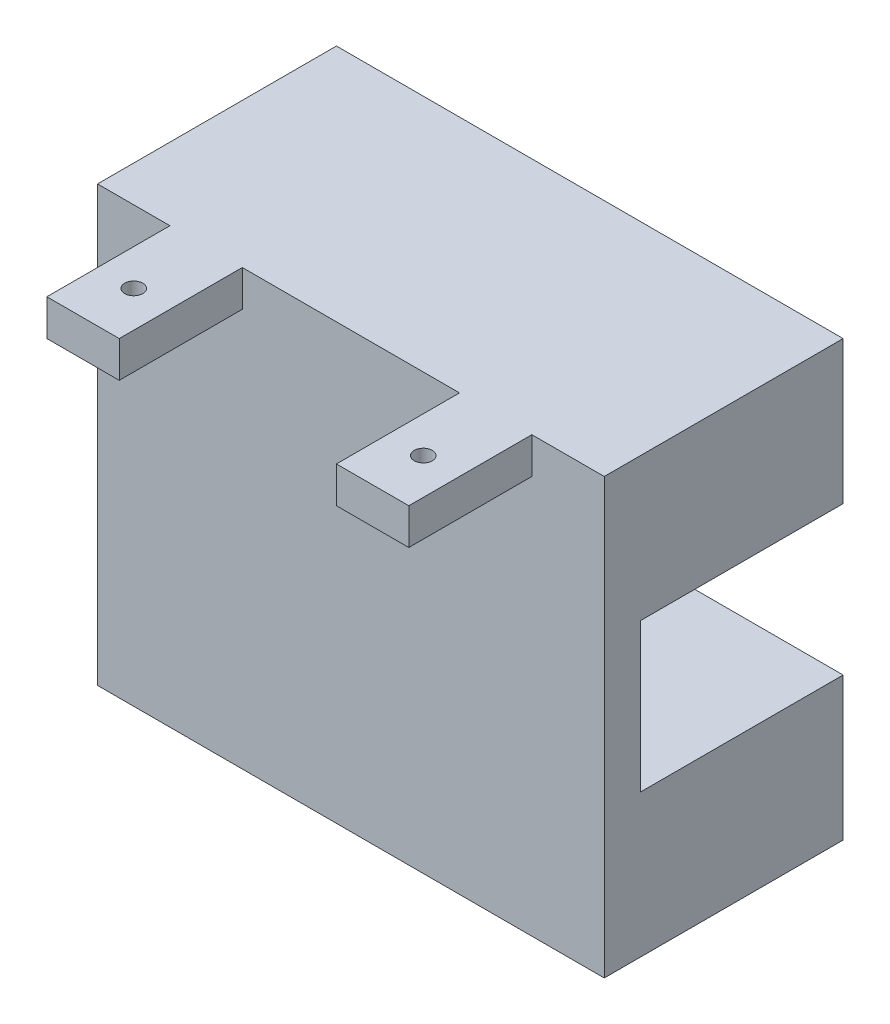
ISO-10303-21;
HEADER;
FILE_DESCRIPTION(('STEP AP214'),'2;1');
FILE_NAME('part.step','',(''),(''),'','','');
FILE_SCHEMA(('AUTOMOTIVE_DESIGN { 1 0 10303 214 1 1 1 1 }'));
ENDSEC;
DATA;
#1=APPLICATION_CONTEXT('core data for automotive mechanical design processes');
#2=APPLICATION_PROTOCOL_DEFINITION('international standard','automotive_design',2000,#1);
#3=PRODUCT_CONTEXT('',#1,'mechanical');
#4=PRODUCT('Part','Part','',(#3));
#5=PRODUCT_RELATED_PRODUCT_CATEGORY('part','',(#4));
#6=PRODUCT_DEFINITION_FORMATION('','',#4);
#7=PRODUCT_DEFINITION_CONTEXT('part definition',#1,'design');
#8=PRODUCT_DEFINITION('design','',#6,#7);
#9=PRODUCT_DEFINITION_SHAPE('','',#8);
#10=(LENGTH_UNIT() NAMED_UNIT(*) SI_UNIT(.MILLI.,.METRE.));
#11=(NAMED_UNIT(*) PLANE_ANGLE_UNIT() SI_UNIT($,.RADIAN.));
#12=(NAMED_UNIT(*) SI_UNIT($,.STERADIAN.) SOLID_ANGLE_UNIT());
#13=UNCERTAINTY_MEASURE_WITH_UNIT(LENGTH_MEASURE(1.E-05),#10,'distance_accuracy_value','');
#14=(GEOMETRIC_REPRESENTATION_CONTEXT(3) GLOBAL_UNCERTAINTY_ASSIGNED_CONTEXT((#13)) GLOBAL_UNIT_ASSIGNED_CONTEXT((#10,
#11,#12)) REPRESENTATION_CONTEXT('',''));
#15=CARTESIAN_POINT('',(0.,0.,0.));
#16=DIRECTION('',(0.,0.,1.));
#17=DIRECTION('',(1.,0.,0.));
#18=AXIS2_PLACEMENT_3D('',#15,#16,#17);
#19=CARTESIAN_POINT('',(0.,0.,33.));
#20=DIRECTION('',(0.,0.,1.));
#21=DIRECTION('',(1.,0.,0.));
#22=AXIS2_PLACEMENT_3D('',#19,#20,#21);
#23=PLANE('',#22);
#24=DIRECTION('',(-1.,0.,0.));
#25=VECTOR('',#24,1.);
#26=CARTESIAN_POINT('',(0.,25.,33.));
#27=LINE('',#26,#25);
#28=CARTESIAN_POINT('',(25.,25.,33.));
#29=VERTEX_POINT('',#28);
#30=CARTESIAN_POINT('',(15.,25.,33.));
#31=VERTEX_POINT('',#30);
#32=EDGE_CURVE('E186',#29,#31,#27,.T.);
#33=ORIENTED_EDGE('',*,*,#32,.T.);
#34=DIRECTION('',(0.,1.,0.));
#35=VECTOR('',#34,1.);
#36=CARTESIAN_POINT('',(15.,0.,33.));
#37=LINE('',#36,#35);
#38=CARTESIAN_POINT('',(15.,30.,33.));
#39=VERTEX_POINT('',#38);
#40=EDGE_CURVE('E179',#31,#39,#37,.T.);
#41=ORIENTED_EDGE('',*,*,#40,.T.);
#42=DIRECTION('',(-1.,0.,0.));
#43=VECTOR('',#42,1.);
#44=CARTESIAN_POINT('',(-35.,30.,33.));
#45=LINE('',#44,#43);
#46=CARTESIAN_POINT('',(-15.,30.,33.));
#47=VERTEX_POINT('',#46);
#48=EDGE_CURVE('E243',#39,#47,#45,.T.);
#49=ORIENTED_EDGE('',*,*,#48,.T.);
#50=DIRECTION('',(0.,-1.,0.));
#51=VECTOR('',#50,1.);
#52=CARTESIAN_POINT('',(-15.,0.,33.));
#53=LINE('',#52,#51);
#54=CARTESIAN_POINT('',(-15.,25.,33.));
#55=VERTEX_POINT('',#54);
#56=EDGE_CURVE('E267',#47,#55,#53,.T.);
#57=ORIENTED_EDGE('',*,*,#56,.T.);
#58=DIRECTION('',(-1.,0.,0.));
#59=VECTOR('',#58,1.);
#60=CARTESIAN_POINT('',(0.,25.,33.));
#61=LINE('',#60,#59);
#62=CARTESIAN_POINT('',(-25.,25.,33.));
#63=VERTEX_POINT('',#62);
#64=EDGE_CURVE('E49',#55,#63,#61,.T.);
#65=ORIENTED_EDGE('',*,*,#64,.T.);
#66=DIRECTION('',(0.,1.,0.));
#67=VECTOR('',#66,1.);
#68=CARTESIAN_POINT('',(-25.,0.,33.));
#69=LINE('',#68,#67);
#70=CARTESIAN_POINT('',(-25.,30.,33.));
#71=VERTEX_POINT('',#70);
#72=EDGE_CURVE('E11',#63,#71,#69,.T.);
#73=ORIENTED_EDGE('',*,*,#72,.T.);
#74=CARTESIAN_POINT('',(-35.,30.,33.));
#75=VERTEX_POINT('',#74);
#76=EDGE_CURVE('E238',#71,#75,#45,.T.);
#77=ORIENTED_EDGE('',*,*,#76,.T.);
#78=DIRECTION('',(0.,-1.,0.));
#79=VECTOR('',#78,1.);
#80=CARTESIAN_POINT('',(-35.,30.,33.));
#81=LINE('',#80,#79);
#82=CARTESIAN_POINT('',(-35.,-30.,33.));
#83=VERTEX_POINT('',#82);
#84=EDGE_CURVE('E242',#75,#83,#81,.T.);
#85=ORIENTED_EDGE('',*,*,#84,.T.);
#86=DIRECTION('',(1.,0.,0.));
#87=VECTOR('',#86,1.);
#88=CARTESIAN_POINT('',(-35.,-30.,33.));
#89=LINE('',#88,#87);
#90=CARTESIAN_POINT('',(35.,-30.,33.));
#91=VERTEX_POINT('',#90);
#92=EDGE_CURVE('E245',#83,#91,#89,.T.);
#93=ORIENTED_EDGE('',*,*,#92,.T.);
#94=DIRECTION('',(0.,1.,0.));
#95=VECTOR('',#94,1.);
#96=CARTESIAN_POINT('',(35.,30.,33.));
#97=LINE('',#96,#95);
#98=CARTESIAN_POINT('',(35.,30.,33.));
#99=VERTEX_POINT('',#98);
#100=EDGE_CURVE('E235',#91,#99,#97,.T.);
#101=ORIENTED_EDGE('',*,*,#100,.T.);
#102=CARTESIAN_POINT('',(25.,30.,33.));
#103=VERTEX_POINT('',#102);
#104=EDGE_CURVE('E240',#99,#103,#45,.T.);
#105=ORIENTED_EDGE('',*,*,#104,.T.);
#106=DIRECTION('',(0.,-1.,0.));
#107=VECTOR('',#106,1.);
#108=CARTESIAN_POINT('',(25.,0.,33.));
#109=LINE('',#108,#107);
#110=EDGE_CURVE('E170',#103,#29,#109,.T.);
#111=ORIENTED_EDGE('',*,*,#110,.T.);
#112=EDGE_LOOP('',(#33,#41,#49,#57,#65,#73,#77,#85,#93,#101,#105,#111));
#113=FACE_BOUND('',#112,.T.);
#114=ADVANCED_FACE('F40',(#113),#23,.T.);
#115=CARTESIAN_POINT('',(0.,0.,0.));
#116=DIRECTION('',(0.,0.,1.));
#117=DIRECTION('',(1.,0.,0.));
#118=AXIS2_PLACEMENT_3D('',#115,#116,#117);
#119=PLANE('',#118);
#120=DIRECTION('',(0.,-1.,0.));
#121=VECTOR('',#120,1.);
#122=CARTESIAN_POINT('',(-35.,30.,0.));
#123=LINE('',#122,#121);
#124=CARTESIAN_POINT('',(-35.,30.,0.));
#125=VERTEX_POINT('',#124);
#126=CARTESIAN_POINT('',(-35.,-30.,0.));
#127=VERTEX_POINT('',#126);
#128=EDGE_CURVE('E253',#125,#127,#123,.T.);
#129=ORIENTED_EDGE('',*,*,#128,.F.);
#130=DIRECTION('',(-1.,0.,0.));
#131=VECTOR('',#130,1.);
#132=CARTESIAN_POINT('',(-35.,30.,0.));
#133=LINE('',#132,#131);
#134=CARTESIAN_POINT('',(35.,30.,0.));
#135=VERTEX_POINT('',#134);
#136=EDGE_CURVE('E251',#135,#125,#133,.T.);
#137=ORIENTED_EDGE('',*,*,#136,.F.);
#138=DIRECTION('',(0.,1.,0.));
#139=VECTOR('',#138,1.);
#140=CARTESIAN_POINT('',(35.,30.,0.));
#141=LINE('',#140,#139);
#142=CARTESIAN_POINT('',(35.,10.25,0.));
#143=VERTEX_POINT('',#142);
#144=EDGE_CURVE('E234',#143,#135,#141,.T.);
#145=ORIENTED_EDGE('',*,*,#144,.F.);
#146=DIRECTION('',(1.,0.,0.));
#147=VECTOR('',#146,1.);
#148=CARTESIAN_POINT('',(-20.35,10.25,0.));
#149=LINE('',#148,#147);
#150=CARTESIAN_POINT('',(-20.35,10.25,0.));
#151=VERTEX_POINT('',#150);
#152=EDGE_CURVE('E226',#151,#143,#149,.T.);
#153=ORIENTED_EDGE('',*,*,#152,.F.);
#154=DIRECTION('',(0.,-1.,0.));
#155=VECTOR('',#154,1.);
#156=CARTESIAN_POINT('',(-20.35,10.25,0.));
#157=LINE('',#156,#155);
#158=CARTESIAN_POINT('',(-20.35,-10.25,0.));
#159=VERTEX_POINT('',#158);
#160=EDGE_CURVE('E220',#151,#159,#157,.T.);
#161=ORIENTED_EDGE('',*,*,#160,.T.);
#162=DIRECTION('',(1.,0.,0.));
#163=VECTOR('',#162,1.);
#164=CARTESIAN_POINT('',(-20.35,-10.25,0.));
#165=LINE('',#164,#163);
#166=CARTESIAN_POINT('',(35.,-10.25,0.));
#167=VERTEX_POINT('',#166);
#168=EDGE_CURVE('E216',#159,#167,#165,.T.);
#169=ORIENTED_EDGE('',*,*,#168,.T.);
#170=CARTESIAN_POINT('',(35.,-30.,0.));
#171=VERTEX_POINT('',#170);
#172=EDGE_CURVE('E248',#171,#167,#141,.T.);
#173=ORIENTED_EDGE('',*,*,#172,.F.);
#174=DIRECTION('',(1.,0.,0.));
#175=VECTOR('',#174,1.);
#176=CARTESIAN_POINT('',(-35.,-30.,0.));
#177=LINE('',#176,#175);
#178=EDGE_CURVE('E239',#127,#171,#177,.T.);
#179=ORIENTED_EDGE('',*,*,#178,.F.);
#180=EDGE_LOOP('',(#129,#137,#145,#153,#161,#169,#173,#179));
#181=FACE_BOUND('',#180,.T.);
#182=ADVANCED_FACE('F304',(#181),#119,.F.);
#183=CARTESIAN_POINT('',(35.,30.,33.));
#184=DIRECTION('',(-1.,0.,0.));
#185=DIRECTION('',(0.,-1.,0.));
#186=AXIS2_PLACEMENT_3D('',#183,#184,#185);
#187=PLANE('',#186);
#188=DIRECTION('',(0.,0.,-1.));
#189=VECTOR('',#188,1.);
#190=CARTESIAN_POINT('',(35.,-10.25,28.));
#191=LINE('',#190,#189);
#192=CARTESIAN_POINT('',(35.,-10.25,28.));
#193=VERTEX_POINT('',#192);
#194=EDGE_CURVE('E213',#193,#167,#191,.T.);
#195=ORIENTED_EDGE('',*,*,#194,.F.);
#196=DIRECTION('',(0.,1.,0.));
#197=VECTOR('',#196,1.);
#198=CARTESIAN_POINT('',(35.,10.25,28.));
#199=LINE('',#198,#197);
#200=CARTESIAN_POINT('',(35.,10.25,28.));
#201=VERTEX_POINT('',#200);
#202=EDGE_CURVE('E207',#193,#201,#199,.T.);
#203=ORIENTED_EDGE('',*,*,#202,.T.);
#204=DIRECTION('',(0.,0.,-1.));
#205=VECTOR('',#204,1.);
#206=CARTESIAN_POINT('',(35.,10.25,28.));
#207=LINE('',#206,#205);
#208=EDGE_CURVE('E210',#201,#143,#207,.T.);
#209=ORIENTED_EDGE('',*,*,#208,.T.);
#210=ORIENTED_EDGE('',*,*,#144,.T.);
#211=DIRECTION('',(0.,0.,-1.));
#212=VECTOR('',#211,1.);
#213=CARTESIAN_POINT('',(35.,30.,33.));
#214=LINE('',#213,#212);
#215=EDGE_CURVE('E264',#99,#135,#214,.T.);
#216=ORIENTED_EDGE('',*,*,#215,.F.);
#217=ORIENTED_EDGE('',*,*,#100,.F.);
#218=DIRECTION('',(0.,0.,-1.));
#219=VECTOR('',#218,1.);
#220=CARTESIAN_POINT('',(35.,-30.,33.));
#221=LINE('',#220,#219);
#222=EDGE_CURVE('E247',#91,#171,#221,.T.);
#223=ORIENTED_EDGE('',*,*,#222,.T.);
#224=ORIENTED_EDGE('',*,*,#172,.T.);
#225=EDGE_LOOP('',(#195,#203,#209,#210,#216,#217,#223,#224));
#226=FACE_BOUND('',#225,.T.);
#227=ADVANCED_FACE('F42',(#226),#187,.F.);
#228=CARTESIAN_POINT('',(-35.,30.,33.));
#229=DIRECTION('',(0.,-1.,0.));
#230=DIRECTION('',(0.,0.,-1.));
#231=AXIS2_PLACEMENT_3D('',#228,#229,#230);
#232=PLANE('',#231);
#233=CARTESIAN_POINT('',(-20.,30.,43.));
#234=DIRECTION('',(0.,1.,0.));
#235=DIRECTION('',(0.,0.,1.));
#236=AXIS2_PLACEMENT_3D('',#233,#234,#235);
#237=CIRCLE('',#236,1.24999999999999);
#238=CARTESIAN_POINT('',(-20.,30.,44.25));
#239=VERTEX_POINT('',#238);
#240=EDGE_CURVE('E283',#239,#239,#237,.T.);
#241=ORIENTED_EDGE('',*,*,#240,.F.);
#242=EDGE_LOOP('',(#241));
#243=FACE_BOUND('',#242,.T.);
#244=CARTESIAN_POINT('',(20.,30.,43.));
#245=DIRECTION('',(0.,1.,0.));
#246=DIRECTION('',(0.,0.,1.));
#247=AXIS2_PLACEMENT_3D('',#244,#245,#246);
#248=CIRCLE('',#247,1.24999999999999);
#249=CARTESIAN_POINT('',(20.,30.,44.25));
#250=VERTEX_POINT('',#249);
#251=EDGE_CURVE('E273',#250,#250,#248,.T.);
#252=ORIENTED_EDGE('',*,*,#251,.F.);
#253=EDGE_LOOP('',(#252));
#254=FACE_BOUND('',#253,.T.);
#255=ORIENTED_EDGE('',*,*,#136,.T.);
#256=DIRECTION('',(0.,0.,-1.));
#257=VECTOR('',#256,1.);
#258=CARTESIAN_POINT('',(-35.,30.,33.));
#259=LINE('',#258,#257);
#260=EDGE_CURVE('E261',#75,#125,#259,.T.);
#261=ORIENTED_EDGE('',*,*,#260,.F.);
#262=ORIENTED_EDGE('',*,*,#76,.F.);
#263=DIRECTION('',(0.,0.,-1.));
#264=VECTOR('',#263,1.);
#265=CARTESIAN_POINT('',(-25.,30.,50.));
#266=LINE('',#265,#264);
#267=CARTESIAN_POINT('',(-25.,30.,50.));
#268=VERTEX_POINT('',#267);
#269=EDGE_CURVE('E205',#268,#71,#266,.T.);
#270=ORIENTED_EDGE('',*,*,#269,.F.);
#271=DIRECTION('',(-1.,0.,0.));
#272=VECTOR('',#271,1.);
#273=CARTESIAN_POINT('',(-15.,30.,50.));
#274=LINE('',#273,#272);
#275=CARTESIAN_POINT('',(-15.,30.,50.));
#276=VERTEX_POINT('',#275);
#277=EDGE_CURVE('E189',#276,#268,#274,.T.);
#278=ORIENTED_EDGE('',*,*,#277,.F.);
#279=DIRECTION('',(0.,0.,-1.));
#280=VECTOR('',#279,1.);
#281=CARTESIAN_POINT('',(-15.,30.,50.));
#282=LINE('',#281,#280);
#283=EDGE_CURVE('E198',#276,#47,#282,.T.);
#284=ORIENTED_EDGE('',*,*,#283,.T.);
#285=ORIENTED_EDGE('',*,*,#48,.F.);
#286=DIRECTION('',(0.,0.,-1.));
#287=VECTOR('',#286,1.);
#288=CARTESIAN_POINT('',(15.,30.,50.));
#289=LINE('',#288,#287);
#290=CARTESIAN_POINT('',(15.,30.,50.));
#291=VERTEX_POINT('',#290);
#292=EDGE_CURVE('E176',#291,#39,#289,.T.);
#293=ORIENTED_EDGE('',*,*,#292,.F.);
#294=DIRECTION('',(-1.,0.,0.));
#295=VECTOR('',#294,1.);
#296=CARTESIAN_POINT('',(25.,30.,50.));
#297=LINE('',#296,#295);
#298=CARTESIAN_POINT('',(25.,30.,50.));
#299=VERTEX_POINT('',#298);
#300=EDGE_CURVE('E161',#299,#291,#297,.T.);
#301=ORIENTED_EDGE('',*,*,#300,.F.);
#302=DIRECTION('',(0.,0.,-1.));
#303=VECTOR('',#302,1.);
#304=CARTESIAN_POINT('',(25.,30.,50.));
#305=LINE('',#304,#303);
#306=EDGE_CURVE('E165',#299,#103,#305,.T.);
#307=ORIENTED_EDGE('',*,*,#306,.T.);
#308=ORIENTED_EDGE('',*,*,#104,.F.);
#309=ORIENTED_EDGE('',*,*,#215,.T.);
#310=EDGE_LOOP('',(#255,#261,#262,#270,#278,#284,#285,#293,#301,#307,#308,#309));
#311=FACE_BOUND('',#310,.T.);
#312=ADVANCED_FACE('F174',(#243,#254,#311),#232,.F.);
#313=CARTESIAN_POINT('',(-35.,30.,33.));
#314=DIRECTION('',(1.,0.,0.));
#315=DIRECTION('',(0.,1.,0.));
#316=AXIS2_PLACEMENT_3D('',#313,#314,#315);
#317=PLANE('',#316);
#318=ORIENTED_EDGE('',*,*,#128,.T.);
#319=DIRECTION('',(0.,0.,-1.));
#320=VECTOR('',#319,1.);
#321=CARTESIAN_POINT('',(-35.,-30.,33.));
#322=LINE('',#321,#320);
#323=EDGE_CURVE('E258',#83,#127,#322,.T.);
#324=ORIENTED_EDGE('',*,*,#323,.F.);
#325=ORIENTED_EDGE('',*,*,#84,.F.);
#326=ORIENTED_EDGE('',*,*,#260,.T.);
#327=EDGE_LOOP('',(#318,#324,#325,#326));
#328=FACE_BOUND('',#327,.T.);
#329=ADVANCED_FACE('F309',(#328),#317,.F.);
#330=CARTESIAN_POINT('',(-35.,-30.,33.));
#331=DIRECTION('',(0.,1.,0.));
#332=DIRECTION('',(0.,0.,1.));
#333=AXIS2_PLACEMENT_3D('',#330,#331,#332);
#334=PLANE('',#333);
#335=ORIENTED_EDGE('',*,*,#178,.T.);
#336=ORIENTED_EDGE('',*,*,#222,.F.);
#337=ORIENTED_EDGE('',*,*,#92,.F.);
#338=ORIENTED_EDGE('',*,*,#323,.T.);
#339=EDGE_LOOP('',(#335,#336,#337,#338));
#340=FACE_BOUND('',#339,.T.);
#341=ADVANCED_FACE('F313',(#340),#334,.F.);
#342=CARTESIAN_POINT('',(-20.35,-10.25,28.));
#343=DIRECTION('',(0.,1.,0.));
#344=DIRECTION('',(0.,0.,1.));
#345=AXIS2_PLACEMENT_3D('',#342,#343,#344);
#346=PLANE('',#345);
#347=ORIENTED_EDGE('',*,*,#168,.F.);
#348=DIRECTION('',(0.,0.,-1.));
#349=VECTOR('',#348,1.);
#350=CARTESIAN_POINT('',(-20.35,-10.25,28.));
#351=LINE('',#350,#349);
#352=CARTESIAN_POINT('',(-20.35,-10.25,28.));
#353=VERTEX_POINT('',#352);
#354=EDGE_CURVE('E224',#353,#159,#351,.T.);
#355=ORIENTED_EDGE('',*,*,#354,.F.);
#356=DIRECTION('',(1.,0.,0.));
#357=VECTOR('',#356,1.);
#358=CARTESIAN_POINT('',(-20.35,-10.25,28.));
#359=LINE('',#358,#357);
#360=EDGE_CURVE('E217',#353,#193,#359,.T.);
#361=ORIENTED_EDGE('',*,*,#360,.T.);
#362=ORIENTED_EDGE('',*,*,#194,.T.);
#363=EDGE_LOOP('',(#347,#355,#361,#362));
#364=FACE_BOUND('',#363,.T.);
#365=ADVANCED_FACE('F347',(#364),#346,.T.);
#366=CARTESIAN_POINT('',(-20.35,10.25,28.));
#367=DIRECTION('',(0.,1.,0.));
#368=DIRECTION('',(0.,0.,1.));
#369=AXIS2_PLACEMENT_3D('',#366,#367,#368);
#370=PLANE('',#369);
#371=ORIENTED_EDGE('',*,*,#152,.T.);
#372=ORIENTED_EDGE('',*,*,#208,.F.);
#373=DIRECTION('',(1.,0.,0.));
#374=VECTOR('',#373,1.);
#375=CARTESIAN_POINT('',(-20.35,10.25,28.));
#376=LINE('',#375,#374);
#377=CARTESIAN_POINT('',(-20.35,10.25,28.));
#378=VERTEX_POINT('',#377);
#379=EDGE_CURVE('E219',#378,#201,#376,.T.);
#380=ORIENTED_EDGE('',*,*,#379,.F.);
#381=DIRECTION('',(0.,0.,-1.));
#382=VECTOR('',#381,1.);
#383=CARTESIAN_POINT('',(-20.35,10.25,28.));
#384=LINE('',#383,#382);
#385=EDGE_CURVE('E232',#378,#151,#384,.T.);
#386=ORIENTED_EDGE('',*,*,#385,.T.);
#387=EDGE_LOOP('',(#371,#372,#380,#386));
#388=FACE_BOUND('',#387,.T.);
#389=ADVANCED_FACE('F505',(#388),#370,.F.);
#390=CARTESIAN_POINT('',(-20.35,10.25,28.));
#391=DIRECTION('',(1.,0.,0.));
#392=DIRECTION('',(0.,1.,0.));
#393=AXIS2_PLACEMENT_3D('',#390,#391,#392);
#394=PLANE('',#393);
#395=ORIENTED_EDGE('',*,*,#160,.F.);
#396=ORIENTED_EDGE('',*,*,#385,.F.);
#397=DIRECTION('',(0.,-1.,0.));
#398=VECTOR('',#397,1.);
#399=CARTESIAN_POINT('',(-20.35,10.25,28.));
#400=LINE('',#399,#398);
#401=EDGE_CURVE('E222',#378,#353,#400,.T.);
#402=ORIENTED_EDGE('',*,*,#401,.T.);
#403=ORIENTED_EDGE('',*,*,#354,.T.);
#404=EDGE_LOOP('',(#395,#396,#402,#403));
#405=FACE_BOUND('',#404,.T.);
#406=ADVANCED_FACE('F337',(#405),#394,.T.);
#407=CARTESIAN_POINT('',(0.,0.,28.));
#408=DIRECTION('',(0.,0.,-1.));
#409=DIRECTION('',(-1.,0.,0.));
#410=AXIS2_PLACEMENT_3D('',#407,#408,#409);
#411=PLANE('',#410);
#412=ORIENTED_EDGE('',*,*,#360,.F.);
#413=ORIENTED_EDGE('',*,*,#401,.F.);
#414=ORIENTED_EDGE('',*,*,#379,.T.);
#415=ORIENTED_EDGE('',*,*,#202,.F.);
#416=EDGE_LOOP('',(#412,#413,#414,#415));
#417=FACE_BOUND('',#416,.T.);
#418=ADVANCED_FACE('F329',(#417),#411,.T.);
#419=CARTESIAN_POINT('',(-25.,30.,50.));
#420=DIRECTION('',(1.,0.,0.));
#421=DIRECTION('',(0.,0.,-1.));
#422=AXIS2_PLACEMENT_3D('',#419,#420,#421);
#423=PLANE('',#422);
#424=ORIENTED_EDGE('',*,*,#72,.F.);
#425=DIRECTION('',(0.,0.,-1.));
#426=VECTOR('',#425,1.);
#427=CARTESIAN_POINT('',(-25.,25.,50.));
#428=LINE('',#427,#426);
#429=CARTESIAN_POINT('',(-25.,25.,50.));
#430=VERTEX_POINT('',#429);
#431=EDGE_CURVE('E202',#430,#63,#428,.T.);
#432=ORIENTED_EDGE('',*,*,#431,.F.);
#433=DIRECTION('',(0.,-1.,0.));
#434=VECTOR('',#433,1.);
#435=CARTESIAN_POINT('',(-25.,30.,50.));
#436=LINE('',#435,#434);
#437=EDGE_CURVE('E192',#268,#430,#436,.T.);
#438=ORIENTED_EDGE('',*,*,#437,.F.);
#439=ORIENTED_EDGE('',*,*,#269,.T.);
#440=EDGE_LOOP('',(#424,#432,#438,#439));
#441=FACE_BOUND('',#440,.T.);
#442=ADVANCED_FACE('F327',(#441),#423,.F.);
#443=CARTESIAN_POINT('',(-25.,25.,50.));
#444=DIRECTION('',(0.,1.,0.));
#445=DIRECTION('',(0.,0.,1.));
#446=AXIS2_PLACEMENT_3D('',#443,#444,#445);
#447=PLANE('',#446);
#448=CARTESIAN_POINT('',(-20.,25.,43.));
#449=DIRECTION('',(0.,1.,0.));
#450=DIRECTION('',(0.,0.,1.));
#451=AXIS2_PLACEMENT_3D('',#448,#449,#450);
#452=CIRCLE('',#451,1.24999999999999);
#453=CARTESIAN_POINT('',(-20.,25.,44.25));
#454=VERTEX_POINT('',#453);
#455=EDGE_CURVE('E44',#454,#454,#452,.T.);
#456=ORIENTED_EDGE('',*,*,#455,.T.);
#457=EDGE_LOOP('',(#456));
#458=FACE_BOUND('',#457,.T.);
#459=ORIENTED_EDGE('',*,*,#64,.F.);
#460=DIRECTION('',(0.,0.,-1.));
#461=VECTOR('',#460,1.);
#462=CARTESIAN_POINT('',(-15.,25.,50.));
#463=LINE('',#462,#461);
#464=CARTESIAN_POINT('',(-15.,25.,50.));
#465=VERTEX_POINT('',#464);
#466=EDGE_CURVE('E65',#465,#55,#463,.T.);
#467=ORIENTED_EDGE('',*,*,#466,.F.);
#468=DIRECTION('',(1.,0.,0.));
#469=VECTOR('',#468,1.);
#470=CARTESIAN_POINT('',(-25.,25.,50.));
#471=LINE('',#470,#469);
#472=EDGE_CURVE('E194',#430,#465,#471,.T.);
#473=ORIENTED_EDGE('',*,*,#472,.F.);
#474=ORIENTED_EDGE('',*,*,#431,.T.);
#475=EDGE_LOOP('',(#459,#467,#473,#474));
#476=FACE_BOUND('',#475,.T.);
#477=ADVANCED_FACE('F325',(#458,#476),#447,.F.);
#478=CARTESIAN_POINT('',(-15.,25.,50.));
#479=DIRECTION('',(-1.,0.,0.));
#480=DIRECTION('',(0.,-1.,0.));
#481=AXIS2_PLACEMENT_3D('',#478,#479,#480);
#482=PLANE('',#481);
#483=ORIENTED_EDGE('',*,*,#56,.F.);
#484=ORIENTED_EDGE('',*,*,#283,.F.);
#485=DIRECTION('',(0.,1.,0.));
#486=VECTOR('',#485,1.);
#487=CARTESIAN_POINT('',(-15.,25.,50.));
#488=LINE('',#487,#486);
#489=EDGE_CURVE('E196',#465,#276,#488,.T.);
#490=ORIENTED_EDGE('',*,*,#489,.F.);
#491=ORIENTED_EDGE('',*,*,#466,.T.);
#492=EDGE_LOOP('',(#483,#484,#490,#491));
#493=FACE_BOUND('',#492,.T.);
#494=ADVANCED_FACE('F318',(#493),#482,.F.);
#495=CARTESIAN_POINT('',(0.,0.,50.));
#496=DIRECTION('',(0.,0.,1.));
#497=DIRECTION('',(1.,0.,0.));
#498=AXIS2_PLACEMENT_3D('',#495,#496,#497);
#499=PLANE('',#498);
#500=ORIENTED_EDGE('',*,*,#277,.T.);
#501=ORIENTED_EDGE('',*,*,#437,.T.);
#502=ORIENTED_EDGE('',*,*,#472,.T.);
#503=ORIENTED_EDGE('',*,*,#489,.T.);
#504=EDGE_LOOP('',(#500,#501,#502,#503));
#505=FACE_BOUND('',#504,.T.);
#506=ADVANCED_FACE('F321',(#505),#499,.T.);
#507=CARTESIAN_POINT('',(15.,30.,50.));
#508=DIRECTION('',(1.,0.,0.));
#509=DIRECTION('',(0.,1.,0.));
#510=AXIS2_PLACEMENT_3D('',#507,#508,#509);
#511=PLANE('',#510);
#512=ORIENTED_EDGE('',*,*,#40,.F.);
#513=DIRECTION('',(0.,0.,-1.));
#514=VECTOR('',#513,1.);
#515=CARTESIAN_POINT('',(15.,25.,50.));
#516=LINE('',#515,#514);
#517=CARTESIAN_POINT('',(15.,25.,50.));
#518=VERTEX_POINT('',#517);
#519=EDGE_CURVE('E276',#518,#31,#516,.T.);
#520=ORIENTED_EDGE('',*,*,#519,.F.);
#521=DIRECTION('',(0.,-1.,0.));
#522=VECTOR('',#521,1.);
#523=CARTESIAN_POINT('',(15.,30.,50.));
#524=LINE('',#523,#522);
#525=EDGE_CURVE('E177',#291,#518,#524,.T.);
#526=ORIENTED_EDGE('',*,*,#525,.F.);
#527=ORIENTED_EDGE('',*,*,#292,.T.);
#528=EDGE_LOOP('',(#512,#520,#526,#527));
#529=FACE_BOUND('',#528,.T.);
#530=ADVANCED_FACE('F373',(#529),#511,.F.);
#531=CARTESIAN_POINT('',(15.,25.,50.));
#532=DIRECTION('',(0.,1.,0.));
#533=DIRECTION('',(-1.,0.,0.));
#534=AXIS2_PLACEMENT_3D('',#531,#532,#533);
#535=PLANE('',#534);
#536=CARTESIAN_POINT('',(20.,25.,43.));
#537=DIRECTION('',(0.,1.,0.));
#538=DIRECTION('',(-1.,0.,0.));
#539=AXIS2_PLACEMENT_3D('',#536,#537,#538);
#540=CIRCLE('',#539,1.24999999999999);
#541=CARTESIAN_POINT('',(18.75,25.,43.));
#542=VERTEX_POINT('',#541);
#543=EDGE_CURVE('E271',#542,#542,#540,.T.);
#544=ORIENTED_EDGE('',*,*,#543,.T.);
#545=EDGE_LOOP('',(#544));
#546=FACE_BOUND('',#545,.T.);
#547=ORIENTED_EDGE('',*,*,#32,.F.);
#548=DIRECTION('',(0.,0.,-1.));
#549=VECTOR('',#548,1.);
#550=CARTESIAN_POINT('',(25.,25.,50.));
#551=LINE('',#550,#549);
#552=CARTESIAN_POINT('',(25.,25.,50.));
#553=VERTEX_POINT('',#552);
#554=EDGE_CURVE('E57',#553,#29,#551,.T.);
#555=ORIENTED_EDGE('',*,*,#554,.F.);
#556=DIRECTION('',(1.,0.,0.));
#557=VECTOR('',#556,1.);
#558=CARTESIAN_POINT('',(15.,25.,50.));
#559=LINE('',#558,#557);
#560=EDGE_CURVE('E164',#518,#553,#559,.T.);
#561=ORIENTED_EDGE('',*,*,#560,.F.);
#562=ORIENTED_EDGE('',*,*,#519,.T.);
#563=EDGE_LOOP('',(#547,#555,#561,#562));
#564=FACE_BOUND('',#563,.T.);
#565=ADVANCED_FACE('F290',(#546,#564),#535,.F.);
#566=CARTESIAN_POINT('',(25.,25.,50.));
#567=DIRECTION('',(-1.,0.,0.));
#568=DIRECTION('',(0.,-1.,0.));
#569=AXIS2_PLACEMENT_3D('',#566,#567,#568);
#570=PLANE('',#569);
#571=ORIENTED_EDGE('',*,*,#110,.F.);
#572=ORIENTED_EDGE('',*,*,#306,.F.);
#573=DIRECTION('',(0.,1.,0.));
#574=VECTOR('',#573,1.);
#575=CARTESIAN_POINT('',(25.,25.,50.));
#576=LINE('',#575,#574);
#577=EDGE_CURVE('E157',#553,#299,#576,.T.);
#578=ORIENTED_EDGE('',*,*,#577,.F.);
#579=ORIENTED_EDGE('',*,*,#554,.T.);
#580=EDGE_LOOP('',(#571,#572,#578,#579));
#581=FACE_BOUND('',#580,.T.);
#582=ADVANCED_FACE('F168',(#581),#570,.F.);
#583=CARTESIAN_POINT('',(0.,0.,50.));
#584=DIRECTION('',(0.,0.,1.));
#585=DIRECTION('',(1.,0.,0.));
#586=AXIS2_PLACEMENT_3D('',#583,#584,#585);
#587=PLANE('',#586);
#588=ORIENTED_EDGE('',*,*,#300,.T.);
#589=ORIENTED_EDGE('',*,*,#525,.T.);
#590=ORIENTED_EDGE('',*,*,#560,.T.);
#591=ORIENTED_EDGE('',*,*,#577,.T.);
#592=EDGE_LOOP('',(#588,#589,#590,#591));
#593=FACE_BOUND('',#592,.T.);
#594=ADVANCED_FACE('F159',(#593),#587,.T.);
#595=CARTESIAN_POINT('',(20.,30.,43.));
#596=DIRECTION('',(0.,1.,0.));
#597=DIRECTION('',(0.,0.,1.));
#598=AXIS2_PLACEMENT_3D('',#595,#596,#597);
#599=CYLINDRICAL_SURFACE('',#598,1.24999999999999);
#600=ORIENTED_EDGE('',*,*,#251,.T.);
#601=EDGE_LOOP('',(#600));
#602=FACE_BOUND('',#601,.T.);
#603=ORIENTED_EDGE('',*,*,#543,.F.);
#604=EDGE_LOOP('',(#603));
#605=FACE_BOUND('',#604,.T.);
#606=ADVANCED_FACE('F365',(#602,#605),#599,.F.);
#607=CARTESIAN_POINT('',(-20.,30.,43.));
#608=DIRECTION('',(0.,1.,0.));
#609=DIRECTION('',(0.,0.,1.));
#610=AXIS2_PLACEMENT_3D('',#607,#608,#609);
#611=CYLINDRICAL_SURFACE('',#610,1.24999999999999);
#612=ORIENTED_EDGE('',*,*,#240,.T.);
#613=EDGE_LOOP('',(#612));
#614=FACE_BOUND('',#613,.T.);
#615=ORIENTED_EDGE('',*,*,#455,.F.);
#616=EDGE_LOOP('',(#615));
#617=FACE_BOUND('',#616,.T.);
#618=ADVANCED_FACE('F362',(#614,#617),#611,.F.);
#619=CLOSED_SHELL('',(#114,#182,#227,#312,#329,#341,#365,#389,#406,#418,#442,#477,#494,#506,
#530,#565,#582,#594,#606,#618));
#620=MANIFOLD_SOLID_BREP('B2',#619);
#621=ADVANCED_BREP_SHAPE_REPRESENTATION('',(#18,#620),#14);
#622=SHAPE_DEFINITION_REPRESENTATION(#9,#621);
ENDSEC;
END-ISO-10303-21;
